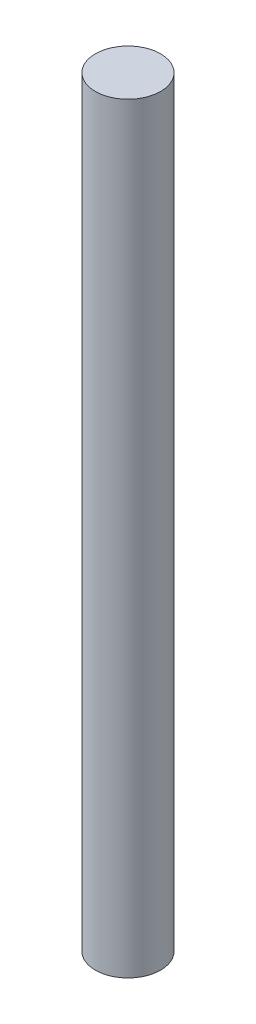
ISO-10303-21;
HEADER;
FILE_DESCRIPTION(('STEP AP214'),'2;1');
FILE_NAME('part.step','',(''),(''),'','','');
FILE_SCHEMA(('AUTOMOTIVE_DESIGN { 1 0 10303 214 1 1 1 1 }'));
ENDSEC;
DATA;
#1=APPLICATION_CONTEXT('core data for automotive mechanical design processes');
#2=APPLICATION_PROTOCOL_DEFINITION('international standard','automotive_design',2000,#1);
#3=PRODUCT_CONTEXT('',#1,'mechanical');
#4=PRODUCT('Part','Part','',(#3));
#5=PRODUCT_RELATED_PRODUCT_CATEGORY('part','',(#4));
#6=PRODUCT_DEFINITION_FORMATION('','',#4);
#7=PRODUCT_DEFINITION_CONTEXT('part definition',#1,'design');
#8=PRODUCT_DEFINITION('design','',#6,#7);
#9=PRODUCT_DEFINITION_SHAPE('','',#8);
#10=(LENGTH_UNIT() NAMED_UNIT(*) SI_UNIT(.MILLI.,.METRE.));
#11=(NAMED_UNIT(*) PLANE_ANGLE_UNIT() SI_UNIT($,.RADIAN.));
#12=(NAMED_UNIT(*) SI_UNIT($,.STERADIAN.) SOLID_ANGLE_UNIT());
#13=UNCERTAINTY_MEASURE_WITH_UNIT(LENGTH_MEASURE(1.E-05),#10,'distance_accuracy_value','');
#14=(GEOMETRIC_REPRESENTATION_CONTEXT(3) GLOBAL_UNCERTAINTY_ASSIGNED_CONTEXT((#13)) GLOBAL_UNIT_ASSIGNED_CONTEXT((#10,
#11,#12)) REPRESENTATION_CONTEXT('',''));
#15=CARTESIAN_POINT('',(0.,0.,0.));
#16=DIRECTION('',(0.,0.,1.));
#17=DIRECTION('',(1.,0.,0.));
#18=AXIS2_PLACEMENT_3D('',#15,#16,#17);
#19=CARTESIAN_POINT('',(0.,44.45,0.));
#20=DIRECTION('',(0.,-1.,0.));
#21=DIRECTION('',(0.,0.,-1.));
#22=AXIS2_PLACEMENT_3D('',#19,#20,#21);
#23=CYLINDRICAL_SURFACE('',#22,1.905);
#24=CARTESIAN_POINT('',(0.,44.45,0.));
#25=DIRECTION('',(0.,1.,0.));
#26=DIRECTION('',(0.,0.,1.));
#27=AXIS2_PLACEMENT_3D('',#24,#25,#26);
#28=CIRCLE('',#27,1.905);
#29=CARTESIAN_POINT('',(0.,44.45,1.905));
#30=VERTEX_POINT('',#29);
#31=EDGE_CURVE('E10',#30,#30,#28,.T.);
#32=ORIENTED_EDGE('',*,*,#31,.F.);
#33=EDGE_LOOP('',(#32));
#34=FACE_BOUND('',#33,.T.);
#35=CARTESIAN_POINT('',(0.,0.,0.));
#36=DIRECTION('',(0.,1.,0.));
#37=DIRECTION('',(0.,0.,1.));
#38=AXIS2_PLACEMENT_3D('',#35,#36,#37);
#39=CIRCLE('',#38,1.905);
#40=CARTESIAN_POINT('',(0.,0.,1.905));
#41=VERTEX_POINT('',#40);
#42=EDGE_CURVE('E36',#41,#41,#39,.T.);
#43=ORIENTED_EDGE('',*,*,#42,.T.);
#44=EDGE_LOOP('',(#43));
#45=FACE_BOUND('',#44,.T.);
#46=ADVANCED_FACE('F33',(#34,#45),#23,.T.);
#47=CARTESIAN_POINT('',(0.,44.45,0.));
#48=DIRECTION('',(0.,1.,0.));
#49=DIRECTION('',(0.,0.,1.));
#50=AXIS2_PLACEMENT_3D('',#47,#48,#49);
#51=PLANE('',#50);
#52=ORIENTED_EDGE('',*,*,#31,.T.);
#53=EDGE_LOOP('',(#52));
#54=FACE_BOUND('',#53,.T.);
#55=ADVANCED_FACE('F48',(#54),#51,.T.);
#56=CARTESIAN_POINT('',(0.,0.,0.));
#57=DIRECTION('',(0.,1.,0.));
#58=DIRECTION('',(0.,0.,1.));
#59=AXIS2_PLACEMENT_3D('',#56,#57,#58);
#60=PLANE('',#59);
#61=ORIENTED_EDGE('',*,*,#42,.F.);
#62=EDGE_LOOP('',(#61));
#63=FACE_BOUND('',#62,.T.);
#64=ADVANCED_FACE('F46',(#63),#60,.F.);
#65=CLOSED_SHELL('',(#46,#55,#64));
#66=MANIFOLD_SOLID_BREP('B2',#65);
#67=ADVANCED_BREP_SHAPE_REPRESENTATION('',(#18,#66),#14);
#68=SHAPE_DEFINITION_REPRESENTATION(#9,#67);
ENDSEC;
END-ISO-10303-21;
